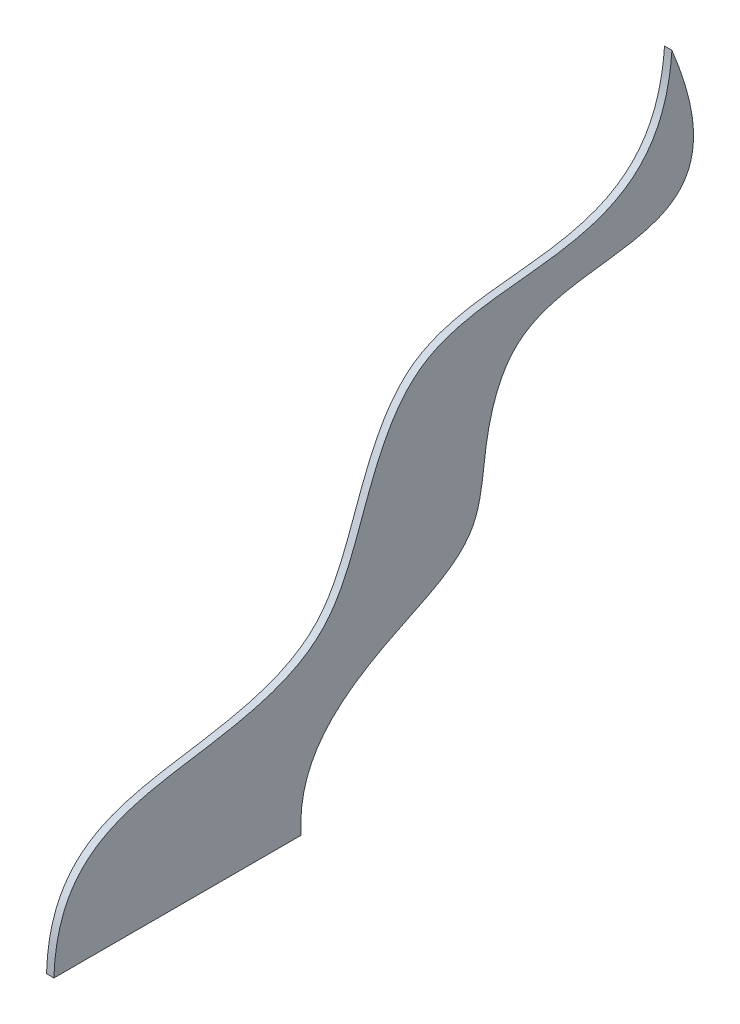
ISO-10303-21;
HEADER;
FILE_DESCRIPTION(('STEP AP214'),'2;1');
FILE_NAME('part.step','',(''),(''),'','','');
FILE_SCHEMA(('AUTOMOTIVE_DESIGN { 1 0 10303 214 1 1 1 1 }'));
ENDSEC;
DATA;
#1=APPLICATION_CONTEXT('core data for automotive mechanical design processes');
#2=APPLICATION_PROTOCOL_DEFINITION('international standard','automotive_design',2000,#1);
#3=PRODUCT_CONTEXT('',#1,'mechanical');
#4=PRODUCT('Part','Part','',(#3));
#5=PRODUCT_RELATED_PRODUCT_CATEGORY('part','',(#4));
#6=PRODUCT_DEFINITION_FORMATION('','',#4);
#7=PRODUCT_DEFINITION_CONTEXT('part definition',#1,'design');
#8=PRODUCT_DEFINITION('design','',#6,#7);
#9=PRODUCT_DEFINITION_SHAPE('','',#8);
#10=(LENGTH_UNIT() NAMED_UNIT(*) SI_UNIT(.MILLI.,.METRE.));
#11=(NAMED_UNIT(*) PLANE_ANGLE_UNIT() SI_UNIT($,.RADIAN.));
#12=(NAMED_UNIT(*) SI_UNIT($,.STERADIAN.) SOLID_ANGLE_UNIT());
#13=UNCERTAINTY_MEASURE_WITH_UNIT(LENGTH_MEASURE(1.E-05),#10,'distance_accuracy_value','');
#14=(GEOMETRIC_REPRESENTATION_CONTEXT(3) GLOBAL_UNCERTAINTY_ASSIGNED_CONTEXT((#13)) GLOBAL_UNIT_ASSIGNED_CONTEXT((#10,
#11,#12)) REPRESENTATION_CONTEXT('',''));
#15=CARTESIAN_POINT('',(0.,0.,0.));
#16=DIRECTION('',(0.,0.,1.));
#17=DIRECTION('',(1.,0.,0.));
#18=AXIS2_PLACEMENT_3D('',#15,#16,#17);
#19=CARTESIAN_POINT('',(3.,0.,0.));
#20=CARTESIAN_POINT('',(3.,42.8671812335903,-1.29663103084801));
#21=CARTESIAN_POINT('',(3.,46.0263607860642,-48.3958192110853));
#22=CARTESIAN_POINT('',(3.,59.5683590730772,-110.868590671254));
#23=CARTESIAN_POINT('',(3.,102.902711957958,-125.729937359715));
#24=CARTESIAN_POINT('',(3.,172.252993095447,-152.878485336013));
#25=CARTESIAN_POINT('',(3.,132.791021890667,-245.401430859576));
#26=CARTESIAN_POINT('',(3.,200.,-250.));
#27=B_SPLINE_CURVE_WITH_KNOTS('',3,(#19,#20,#21,#22,#23,#24,#25,#26),.UNSPECIFIED.,.F.,.F.,(4,1,
1,1,1,4),(0.,0.258213757096418,0.403782189145841,0.510035650241941,0.643754128211682,1.),.UNSPECIFIED.);
#28=DIRECTION('',(-1.,0.,0.));
#29=VECTOR('',#28,1.);
#30=SURFACE_OF_LINEAR_EXTRUSION('',#27,#29);
#31=CARTESIAN_POINT('',(0.,0.,0.));
#32=CARTESIAN_POINT('',(0.,42.8671812335903,-1.29663103084801));
#33=CARTESIAN_POINT('',(0.,46.0263607860642,-48.3958192110853));
#34=CARTESIAN_POINT('',(0.,59.5683590730772,-110.868590671254));
#35=CARTESIAN_POINT('',(0.,102.902711957958,-125.729937359715));
#36=CARTESIAN_POINT('',(0.,172.252993095447,-152.878485336013));
#37=CARTESIAN_POINT('',(0.,132.791021890667,-245.401430859576));
#38=CARTESIAN_POINT('',(0.,200.,-250.));
#39=B_SPLINE_CURVE_WITH_KNOTS('',3,(#31,#32,#33,#34,#35,#36,#37,#38),.UNSPECIFIED.,.F.,.F.,(4,1,
1,1,1,4),(0.,0.258213757096418,0.403782189145841,0.510035650241941,0.643754128211682,1.),.UNSPECIFIED.);
#40=CARTESIAN_POINT('',(0.,0.,0.));
#41=VERTEX_POINT('',#40);
#42=CARTESIAN_POINT('',(0.,200.,-250.));
#43=VERTEX_POINT('',#42);
#44=EDGE_CURVE('E137',#41,#43,#39,.T.);
#45=ORIENTED_EDGE('',*,*,#44,.F.);
#46=DIRECTION('',(-1.,0.,0.));
#47=VECTOR('',#46,1.);
#48=CARTESIAN_POINT('',(3.,0.,0.));
#49=LINE('',#48,#47);
#50=CARTESIAN_POINT('',(3.,0.,0.));
#51=VERTEX_POINT('',#50);
#52=EDGE_CURVE('E11',#51,#41,#49,.T.);
#53=ORIENTED_EDGE('',*,*,#52,.F.);
#54=CARTESIAN_POINT('',(3.,200.,-250.));
#55=VERTEX_POINT('',#54);
#56=EDGE_CURVE('E72',#51,#55,#27,.T.);
#57=ORIENTED_EDGE('',*,*,#56,.T.);
#58=DIRECTION('',(-1.,0.,0.));
#59=VECTOR('',#58,1.);
#60=CARTESIAN_POINT('',(3.,200.,-250.));
#61=LINE('',#60,#59);
#62=EDGE_CURVE('E36',#55,#43,#61,.T.);
#63=ORIENTED_EDGE('',*,*,#62,.T.);
#64=EDGE_LOOP('',(#45,#53,#57,#63));
#65=FACE_BOUND('',#64,.T.);
#66=ADVANCED_FACE('F32',(#65),#30,.T.);
#67=CARTESIAN_POINT('',(3.,0.,0.));
#68=DIRECTION('',(0.,1.,0.));
#69=DIRECTION('',(0.,0.,1.));
#70=AXIS2_PLACEMENT_3D('',#67,#68,#69);
#71=PLANE('',#70);
#72=DIRECTION('',(0.,0.,-1.));
#73=VECTOR('',#72,1.);
#74=CARTESIAN_POINT('',(0.,0.,0.));
#75=LINE('',#74,#73);
#76=CARTESIAN_POINT('',(0.,0.,-100.));
#77=VERTEX_POINT('',#76);
#78=EDGE_CURVE('E63',#41,#77,#75,.T.);
#79=ORIENTED_EDGE('',*,*,#78,.T.);
#80=DIRECTION('',(-1.,0.,0.));
#81=VECTOR('',#80,1.);
#82=CARTESIAN_POINT('',(3.,0.,-100.));
#83=LINE('',#82,#81);
#84=CARTESIAN_POINT('',(3.,0.,-100.));
#85=VERTEX_POINT('',#84);
#86=EDGE_CURVE('E42',#85,#77,#83,.T.);
#87=ORIENTED_EDGE('',*,*,#86,.F.);
#88=DIRECTION('',(0.,0.,-1.));
#89=VECTOR('',#88,1.);
#90=CARTESIAN_POINT('',(3.,0.,0.));
#91=LINE('',#90,#89);
#92=EDGE_CURVE('E73',#51,#85,#91,.T.);
#93=ORIENTED_EDGE('',*,*,#92,.F.);
#94=ORIENTED_EDGE('',*,*,#52,.T.);
#95=EDGE_LOOP('',(#79,#87,#93,#94));
#96=FACE_BOUND('',#95,.T.);
#97=ADVANCED_FACE('F98',(#96),#71,.F.);
#98=CARTESIAN_POINT('',(3.,0.,-100.));
#99=CARTESIAN_POINT('',(3.,27.9437453638833,-98.11477947724));
#100=CARTESIAN_POINT('',(3.,48.2588704788605,-126.668766504837));
#101=CARTESIAN_POINT('',(3.,67.0114495250341,-173.094046968787));
#102=CARTESIAN_POINT('',(3.,101.064750008453,-173.489851014506));
#103=CARTESIAN_POINT('',(3.,160.453215445113,-193.334055137308));
#104=CARTESIAN_POINT('',(3.,119.321534615917,-283.199348363275));
#105=CARTESIAN_POINT('',(3.,200.,-250.));
#106=B_SPLINE_CURVE_WITH_KNOTS('',3,(#98,#99,#100,#101,#102,#103,#104,#105),.UNSPECIFIED.,.F.,
.F.,(4,1,1,1,1,4),(0.,0.251771734506507,0.382046106684089,0.484861399410862,0.597251359152697,
1.),.UNSPECIFIED.);
#107=DIRECTION('',(-1.,0.,0.));
#108=VECTOR('',#107,1.);
#109=SURFACE_OF_LINEAR_EXTRUSION('',#106,#108);
#110=CARTESIAN_POINT('',(0.,0.,-100.));
#111=CARTESIAN_POINT('',(0.,27.9437453638833,-98.11477947724));
#112=CARTESIAN_POINT('',(0.,48.2588704788605,-126.668766504837));
#113=CARTESIAN_POINT('',(0.,67.0114495250341,-173.094046968787));
#114=CARTESIAN_POINT('',(0.,101.064750008453,-173.489851014506));
#115=CARTESIAN_POINT('',(0.,160.453215445113,-193.334055137308));
#116=CARTESIAN_POINT('',(0.,119.321534615917,-283.199348363275));
#117=CARTESIAN_POINT('',(0.,200.,-250.));
#118=B_SPLINE_CURVE_WITH_KNOTS('',3,(#110,#111,#112,#113,#114,#115,#116,#117),.UNSPECIFIED.,.F.,
.F.,(4,1,1,1,1,4),(0.,0.251771734506507,0.382046106684089,0.484861399410862,0.597251359152697,
1.),.UNSPECIFIED.);
#119=EDGE_CURVE('E79',#77,#43,#118,.T.);
#120=ORIENTED_EDGE('',*,*,#119,.T.);
#121=ORIENTED_EDGE('',*,*,#62,.F.);
#122=EDGE_CURVE('E69',#85,#55,#106,.T.);
#123=ORIENTED_EDGE('',*,*,#122,.F.);
#124=ORIENTED_EDGE('',*,*,#86,.T.);
#125=EDGE_LOOP('',(#120,#121,#123,#124));
#126=FACE_BOUND('',#125,.T.);
#127=ADVANCED_FACE('F77',(#126),#109,.F.);
#128=CARTESIAN_POINT('',(3.,96.5717998932089,-123.751672121435));
#129=DIRECTION('',(1.,0.,0.));
#130=DIRECTION('',(0.,0.,-1.));
#131=AXIS2_PLACEMENT_3D('',#128,#129,#130);
#132=PLANE('',#131);
#133=ORIENTED_EDGE('',*,*,#56,.F.);
#134=ORIENTED_EDGE('',*,*,#92,.T.);
#135=ORIENTED_EDGE('',*,*,#122,.T.);
#136=EDGE_LOOP('',(#133,#134,#135));
#137=FACE_BOUND('',#136,.T.);
#138=ADVANCED_FACE('F71',(#137),#132,.T.);
#139=CARTESIAN_POINT('',(0.,96.5717998932089,-123.751672121435));
#140=DIRECTION('',(1.,0.,0.));
#141=DIRECTION('',(0.,0.,-1.));
#142=AXIS2_PLACEMENT_3D('',#139,#140,#141);
#143=PLANE('',#142);
#144=ORIENTED_EDGE('',*,*,#44,.T.);
#145=ORIENTED_EDGE('',*,*,#119,.F.);
#146=ORIENTED_EDGE('',*,*,#78,.F.);
#147=EDGE_LOOP('',(#144,#145,#146));
#148=FACE_BOUND('',#147,.T.);
#149=ADVANCED_FACE('F101',(#148),#143,.F.);
#150=CLOSED_SHELL('',(#66,#97,#127,#138,#149));
#151=MANIFOLD_SOLID_BREP('B2',#150);
#152=ADVANCED_BREP_SHAPE_REPRESENTATION('',(#18,#151),#14);
#153=SHAPE_DEFINITION_REPRESENTATION(#9,#152);
ENDSEC;
END-ISO-10303-21;
